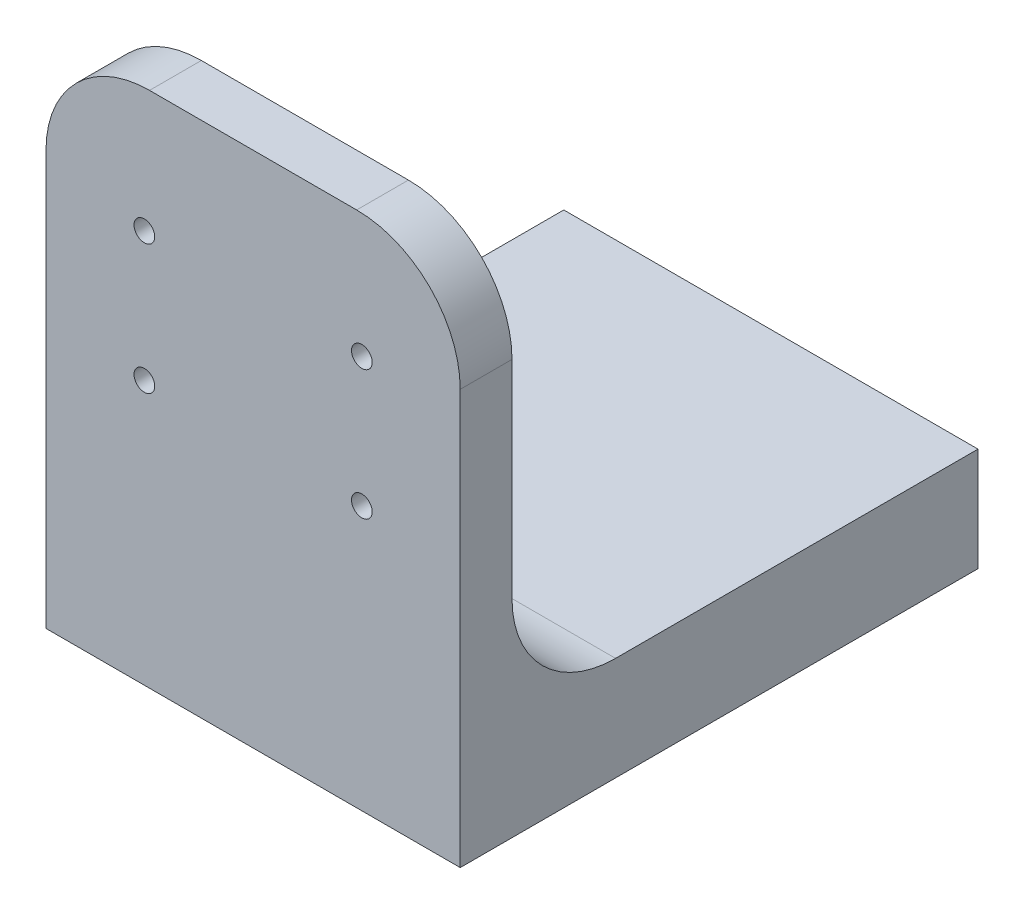
ISO-10303-21;
HEADER;
FILE_DESCRIPTION(('STEP AP214'),'2;1');
FILE_NAME('part.step','',(''),(''),'','','');
FILE_SCHEMA(('AUTOMOTIVE_DESIGN { 1 0 10303 214 1 1 1 1 }'));
ENDSEC;
DATA;
#1=APPLICATION_CONTEXT('core data for automotive mechanical design processes');
#2=APPLICATION_PROTOCOL_DEFINITION('international standard','automotive_design',2000,#1);
#3=PRODUCT_CONTEXT('',#1,'mechanical');
#4=PRODUCT('Part','Part','',(#3));
#5=PRODUCT_RELATED_PRODUCT_CATEGORY('part','',(#4));
#6=PRODUCT_DEFINITION_FORMATION('','',#4);
#7=PRODUCT_DEFINITION_CONTEXT('part definition',#1,'design');
#8=PRODUCT_DEFINITION('design','',#6,#7);
#9=PRODUCT_DEFINITION_SHAPE('','',#8);
#10=(LENGTH_UNIT() NAMED_UNIT(*) SI_UNIT(.MILLI.,.METRE.));
#11=(NAMED_UNIT(*) PLANE_ANGLE_UNIT() SI_UNIT($,.RADIAN.));
#12=(NAMED_UNIT(*) SI_UNIT($,.STERADIAN.) SOLID_ANGLE_UNIT());
#13=UNCERTAINTY_MEASURE_WITH_UNIT(LENGTH_MEASURE(1.E-05),#10,'distance_accuracy_value','');
#14=(GEOMETRIC_REPRESENTATION_CONTEXT(3) GLOBAL_UNCERTAINTY_ASSIGNED_CONTEXT((#13)) GLOBAL_UNIT_ASSIGNED_CONTEXT((#10,
#11,#12)) REPRESENTATION_CONTEXT('',''));
#15=CARTESIAN_POINT('',(0.,0.,0.));
#16=DIRECTION('',(0.,0.,1.));
#17=DIRECTION('',(1.,0.,0.));
#18=AXIS2_PLACEMENT_3D('',#15,#16,#17);
#19=CARTESIAN_POINT('',(0.,10.,0.));
#20=DIRECTION('',(0.,-1.,0.));
#21=DIRECTION('',(0.,0.,-1.));
#22=AXIS2_PLACEMENT_3D('',#19,#20,#21);
#23=PLANE('',#22);
#24=DIRECTION('',(0.,0.,1.));
#25=VECTOR('',#24,1.);
#26=CARTESIAN_POINT('',(-20.,10.,25.));
#27=LINE('',#26,#25);
#28=CARTESIAN_POINT('',(-20.,10.,-25.));
#29=VERTEX_POINT('',#28);
#30=CARTESIAN_POINT('',(-20.,10.,10.));
#31=VERTEX_POINT('',#30);
#32=EDGE_CURVE('E124',#29,#31,#27,.T.);
#33=ORIENTED_EDGE('',*,*,#32,.T.);
#34=DIRECTION('',(-1.,0.,0.));
#35=VECTOR('',#34,1.);
#36=CARTESIAN_POINT('',(20.,10.,10.));
#37=LINE('',#36,#35);
#38=CARTESIAN_POINT('',(20.,10.,10.));
#39=VERTEX_POINT('',#38);
#40=EDGE_CURVE('E54',#31,#39,#37,.F.);
#41=ORIENTED_EDGE('',*,*,#40,.T.);
#42=DIRECTION('',(0.,0.,-1.));
#43=VECTOR('',#42,1.);
#44=CARTESIAN_POINT('',(20.,10.,25.));
#45=LINE('',#44,#43);
#46=CARTESIAN_POINT('',(20.,10.,-25.));
#47=VERTEX_POINT('',#46);
#48=EDGE_CURVE('E107',#39,#47,#45,.T.);
#49=ORIENTED_EDGE('',*,*,#48,.T.);
#50=DIRECTION('',(-1.,0.,0.));
#51=VECTOR('',#50,1.);
#52=CARTESIAN_POINT('',(-20.,10.,-25.));
#53=LINE('',#52,#51);
#54=EDGE_CURVE('E109',#47,#29,#53,.T.);
#55=ORIENTED_EDGE('',*,*,#54,.T.);
#56=EDGE_LOOP('',(#33,#41,#49,#55));
#57=FACE_BOUND('',#56,.T.);
#58=ADVANCED_FACE('F38',(#57),#23,.F.);
#59=CARTESIAN_POINT('',(20.,10.,25.));
#60=DIRECTION('',(-1.,0.,0.));
#61=DIRECTION('',(0.,0.,1.));
#62=AXIS2_PLACEMENT_3D('',#59,#60,#61);
#63=PLANE('',#62);
#64=DIRECTION('',(0.,-1.,0.));
#65=VECTOR('',#64,1.);
#66=CARTESIAN_POINT('',(20.,50.,20.));
#67=LINE('',#66,#65);
#68=CARTESIAN_POINT('',(20.,40.,20.));
#69=VERTEX_POINT('',#68);
#70=CARTESIAN_POINT('',(20.,20.,20.));
#71=VERTEX_POINT('',#70);
#72=EDGE_CURVE('E188',#69,#71,#67,.T.);
#73=ORIENTED_EDGE('',*,*,#72,.F.);
#74=DIRECTION('',(0.,0.,-1.));
#75=VECTOR('',#74,1.);
#76=CARTESIAN_POINT('',(20.,40.,25.));
#77=LINE('',#76,#75);
#78=CARTESIAN_POINT('',(20.,40.,25.));
#79=VERTEX_POINT('',#78);
#80=EDGE_CURVE('E169',#69,#79,#77,.F.);
#81=ORIENTED_EDGE('',*,*,#80,.T.);
#82=DIRECTION('',(0.,-1.,0.));
#83=VECTOR('',#82,1.);
#84=CARTESIAN_POINT('',(20.,10.,25.));
#85=LINE('',#84,#83);
#86=CARTESIAN_POINT('',(20.,0.,25.));
#87=VERTEX_POINT('',#86);
#88=EDGE_CURVE('E183',#79,#87,#85,.T.);
#89=ORIENTED_EDGE('',*,*,#88,.T.);
#90=DIRECTION('',(0.,0.,-1.));
#91=VECTOR('',#90,1.);
#92=CARTESIAN_POINT('',(20.,0.,25.));
#93=LINE('',#92,#91);
#94=CARTESIAN_POINT('',(20.,0.,-25.));
#95=VERTEX_POINT('',#94);
#96=EDGE_CURVE('E128',#87,#95,#93,.T.);
#97=ORIENTED_EDGE('',*,*,#96,.T.);
#98=DIRECTION('',(0.,-1.,0.));
#99=VECTOR('',#98,1.);
#100=CARTESIAN_POINT('',(20.,10.,-25.));
#101=LINE('',#100,#99);
#102=EDGE_CURVE('E118',#47,#95,#101,.T.);
#103=ORIENTED_EDGE('',*,*,#102,.F.);
#104=ORIENTED_EDGE('',*,*,#48,.F.);
#105=CARTESIAN_POINT('',(20.,20.,10.));
#106=DIRECTION('',(-1.,0.,0.));
#107=DIRECTION('',(0.,0.,1.));
#108=AXIS2_PLACEMENT_3D('',#105,#106,#107);
#109=CIRCLE('',#108,10.);
#110=EDGE_CURVE('E11',#39,#71,#109,.T.);
#111=ORIENTED_EDGE('',*,*,#110,.T.);
#112=EDGE_LOOP('',(#73,#81,#89,#97,#103,#104,#111));
#113=FACE_BOUND('',#112,.T.);
#114=ADVANCED_FACE('F126',(#113),#63,.F.);
#115=CARTESIAN_POINT('',(-20.,10.,-25.));
#116=DIRECTION('',(0.,0.,1.));
#117=DIRECTION('',(1.,0.,0.));
#118=AXIS2_PLACEMENT_3D('',#115,#116,#117);
#119=PLANE('',#118);
#120=DIRECTION('',(-1.,0.,0.));
#121=VECTOR('',#120,1.);
#122=CARTESIAN_POINT('',(-20.,0.,-25.));
#123=LINE('',#122,#121);
#124=CARTESIAN_POINT('',(-20.,0.,-25.));
#125=VERTEX_POINT('',#124);
#126=EDGE_CURVE('E195',#95,#125,#123,.T.);
#127=ORIENTED_EDGE('',*,*,#126,.T.);
#128=DIRECTION('',(0.,-1.,0.));
#129=VECTOR('',#128,1.);
#130=CARTESIAN_POINT('',(-20.,10.,-25.));
#131=LINE('',#130,#129);
#132=EDGE_CURVE('E121',#29,#125,#131,.T.);
#133=ORIENTED_EDGE('',*,*,#132,.F.);
#134=ORIENTED_EDGE('',*,*,#54,.F.);
#135=ORIENTED_EDGE('',*,*,#102,.T.);
#136=EDGE_LOOP('',(#127,#133,#134,#135));
#137=FACE_BOUND('',#136,.T.);
#138=ADVANCED_FACE('F117',(#137),#119,.F.);
#139=CARTESIAN_POINT('',(-20.,10.,25.));
#140=DIRECTION('',(1.,0.,0.));
#141=DIRECTION('',(0.,0.,-1.));
#142=AXIS2_PLACEMENT_3D('',#139,#140,#141);
#143=PLANE('',#142);
#144=DIRECTION('',(0.,-1.,0.));
#145=VECTOR('',#144,1.);
#146=CARTESIAN_POINT('',(-20.,10.,25.));
#147=LINE('',#146,#145);
#148=CARTESIAN_POINT('',(-20.,40.,25.));
#149=VERTEX_POINT('',#148);
#150=CARTESIAN_POINT('',(-20.,0.,25.));
#151=VERTEX_POINT('',#150);
#152=EDGE_CURVE('E137',#149,#151,#147,.T.);
#153=ORIENTED_EDGE('',*,*,#152,.F.);
#154=DIRECTION('',(0.,0.,1.));
#155=VECTOR('',#154,1.);
#156=CARTESIAN_POINT('',(-20.,40.,25.));
#157=LINE('',#156,#155);
#158=CARTESIAN_POINT('',(-20.,40.,20.));
#159=VERTEX_POINT('',#158);
#160=EDGE_CURVE('E156',#149,#159,#157,.F.);
#161=ORIENTED_EDGE('',*,*,#160,.T.);
#162=DIRECTION('',(0.,-1.,0.));
#163=VECTOR('',#162,1.);
#164=CARTESIAN_POINT('',(-20.,50.,20.));
#165=LINE('',#164,#163);
#166=CARTESIAN_POINT('',(-20.,20.,20.));
#167=VERTEX_POINT('',#166);
#168=EDGE_CURVE('E179',#159,#167,#165,.T.);
#169=ORIENTED_EDGE('',*,*,#168,.T.);
#170=CARTESIAN_POINT('',(-20.,20.,10.));
#171=DIRECTION('',(1.,0.,0.));
#172=DIRECTION('',(0.,0.,-1.));
#173=AXIS2_PLACEMENT_3D('',#170,#171,#172);
#174=CIRCLE('',#173,10.);
#175=EDGE_CURVE('E47',#167,#31,#174,.T.);
#176=ORIENTED_EDGE('',*,*,#175,.T.);
#177=ORIENTED_EDGE('',*,*,#32,.F.);
#178=ORIENTED_EDGE('',*,*,#132,.T.);
#179=DIRECTION('',(0.,0.,1.));
#180=VECTOR('',#179,1.);
#181=CARTESIAN_POINT('',(-20.,0.,25.));
#182=LINE('',#181,#180);
#183=EDGE_CURVE('E203',#125,#151,#182,.T.);
#184=ORIENTED_EDGE('',*,*,#183,.T.);
#185=EDGE_LOOP('',(#153,#161,#169,#176,#177,#178,#184));
#186=FACE_BOUND('',#185,.T.);
#187=ADVANCED_FACE('F177',(#186),#143,.F.);
#188=CARTESIAN_POINT('',(-20.,10.,25.));
#189=DIRECTION('',(0.,0.,-1.));
#190=DIRECTION('',(-1.,0.,0.));
#191=AXIS2_PLACEMENT_3D('',#188,#189,#190);
#192=PLANE('',#191);
#193=CARTESIAN_POINT('',(-10.5,38.,25.));
#194=DIRECTION('',(0.,0.,1.));
#195=DIRECTION('',(1.,0.,0.));
#196=AXIS2_PLACEMENT_3D('',#193,#194,#195);
#197=CIRCLE('',#196,0.999999999999999);
#198=CARTESIAN_POINT('',(-9.5,38.,25.));
#199=VERTEX_POINT('',#198);
#200=EDGE_CURVE('E269',#199,#199,#197,.T.);
#201=ORIENTED_EDGE('',*,*,#200,.F.);
#202=EDGE_LOOP('',(#201));
#203=FACE_BOUND('',#202,.T.);
#204=CARTESIAN_POINT('',(10.5,38.,25.));
#205=DIRECTION('',(0.,0.,1.));
#206=DIRECTION('',(1.,0.,0.));
#207=AXIS2_PLACEMENT_3D('',#204,#205,#206);
#208=CIRCLE('',#207,0.999999999999999);
#209=CARTESIAN_POINT('',(11.5,38.,25.));
#210=VERTEX_POINT('',#209);
#211=EDGE_CURVE('E274',#210,#210,#208,.T.);
#212=ORIENTED_EDGE('',*,*,#211,.F.);
#213=EDGE_LOOP('',(#212));
#214=FACE_BOUND('',#213,.T.);
#215=CARTESIAN_POINT('',(-10.5,25.5,25.));
#216=DIRECTION('',(0.,0.,1.));
#217=DIRECTION('',(1.,0.,0.));
#218=AXIS2_PLACEMENT_3D('',#215,#216,#217);
#219=CIRCLE('',#218,0.999999999999999);
#220=CARTESIAN_POINT('',(-9.5,25.5,25.));
#221=VERTEX_POINT('',#220);
#222=EDGE_CURVE('E286',#221,#221,#219,.T.);
#223=ORIENTED_EDGE('',*,*,#222,.F.);
#224=EDGE_LOOP('',(#223));
#225=FACE_BOUND('',#224,.T.);
#226=CARTESIAN_POINT('',(10.5,25.5,25.));
#227=DIRECTION('',(0.,0.,1.));
#228=DIRECTION('',(1.,0.,0.));
#229=AXIS2_PLACEMENT_3D('',#226,#227,#228);
#230=CIRCLE('',#229,0.999999999999999);
#231=CARTESIAN_POINT('',(11.5,25.5,25.));
#232=VERTEX_POINT('',#231);
#233=EDGE_CURVE('E145',#232,#232,#230,.T.);
#234=ORIENTED_EDGE('',*,*,#233,.F.);
#235=EDGE_LOOP('',(#234));
#236=FACE_BOUND('',#235,.T.);
#237=DIRECTION('',(1.,0.,0.));
#238=VECTOR('',#237,1.);
#239=CARTESIAN_POINT('',(-20.,50.,25.));
#240=LINE('',#239,#238);
#241=CARTESIAN_POINT('',(-10.,50.,25.));
#242=VERTEX_POINT('',#241);
#243=CARTESIAN_POINT('',(10.,50.,25.));
#244=VERTEX_POINT('',#243);
#245=EDGE_CURVE('E144',#242,#244,#240,.T.);
#246=ORIENTED_EDGE('',*,*,#245,.F.);
#247=CARTESIAN_POINT('',(-10.,40.,25.));
#248=DIRECTION('',(0.,0.,-1.));
#249=DIRECTION('',(-1.,0.,0.));
#250=AXIS2_PLACEMENT_3D('',#247,#248,#249);
#251=CIRCLE('',#250,10.);
#252=EDGE_CURVE('E153',#242,#149,#251,.F.);
#253=ORIENTED_EDGE('',*,*,#252,.T.);
#254=ORIENTED_EDGE('',*,*,#152,.T.);
#255=DIRECTION('',(1.,0.,0.));
#256=VECTOR('',#255,1.);
#257=CARTESIAN_POINT('',(-20.,0.,25.));
#258=LINE('',#257,#256);
#259=EDGE_CURVE('E113',#151,#87,#258,.T.);
#260=ORIENTED_EDGE('',*,*,#259,.T.);
#261=ORIENTED_EDGE('',*,*,#88,.F.);
#262=CARTESIAN_POINT('',(10.,40.,25.));
#263=DIRECTION('',(0.,0.,-1.));
#264=DIRECTION('',(-1.,0.,0.));
#265=AXIS2_PLACEMENT_3D('',#262,#263,#264);
#266=CIRCLE('',#265,10.);
#267=EDGE_CURVE('E150',#79,#244,#266,.F.);
#268=ORIENTED_EDGE('',*,*,#267,.T.);
#269=EDGE_LOOP('',(#246,#253,#254,#260,#261,#268));
#270=FACE_BOUND('',#269,.T.);
#271=ADVANCED_FACE('F214',(#203,#214,#225,#236,#270),#192,.F.);
#272=CARTESIAN_POINT('',(0.,0.,0.));
#273=DIRECTION('',(0.,-1.,0.));
#274=DIRECTION('',(0.,0.,-1.));
#275=AXIS2_PLACEMENT_3D('',#272,#273,#274);
#276=PLANE('',#275);
#277=ORIENTED_EDGE('',*,*,#96,.F.);
#278=ORIENTED_EDGE('',*,*,#259,.F.);
#279=ORIENTED_EDGE('',*,*,#183,.F.);
#280=ORIENTED_EDGE('',*,*,#126,.F.);
#281=EDGE_LOOP('',(#277,#278,#279,#280));
#282=FACE_BOUND('',#281,.T.);
#283=ADVANCED_FACE('F220',(#282),#276,.T.);
#284=CARTESIAN_POINT('',(-20.,50.,20.));
#285=DIRECTION('',(0.,0.,1.));
#286=DIRECTION('',(1.,0.,0.));
#287=AXIS2_PLACEMENT_3D('',#284,#285,#286);
#288=PLANE('',#287);
#289=CARTESIAN_POINT('',(-10.5,38.,20.));
#290=DIRECTION('',(0.,0.,1.));
#291=DIRECTION('',(1.,0.,0.));
#292=AXIS2_PLACEMENT_3D('',#289,#290,#291);
#293=CIRCLE('',#292,0.999999999999996);
#294=CARTESIAN_POINT('',(-9.50000000000001,38.,20.));
#295=VERTEX_POINT('',#294);
#296=EDGE_CURVE('E272',#295,#295,#293,.T.);
#297=ORIENTED_EDGE('',*,*,#296,.T.);
#298=EDGE_LOOP('',(#297));
#299=FACE_BOUND('',#298,.T.);
#300=CARTESIAN_POINT('',(10.5,38.,20.));
#301=DIRECTION('',(0.,0.,1.));
#302=DIRECTION('',(1.,0.,0.));
#303=AXIS2_PLACEMENT_3D('',#300,#301,#302);
#304=CIRCLE('',#303,0.999999999999996);
#305=CARTESIAN_POINT('',(11.5,38.,20.));
#306=VERTEX_POINT('',#305);
#307=EDGE_CURVE('E279',#306,#306,#304,.T.);
#308=ORIENTED_EDGE('',*,*,#307,.T.);
#309=EDGE_LOOP('',(#308));
#310=FACE_BOUND('',#309,.T.);
#311=CARTESIAN_POINT('',(-10.5,25.5,20.));
#312=DIRECTION('',(0.,0.,1.));
#313=DIRECTION('',(1.,0.,0.));
#314=AXIS2_PLACEMENT_3D('',#311,#312,#313);
#315=CIRCLE('',#314,0.999999999999996);
#316=CARTESIAN_POINT('',(-9.50000000000001,25.5,20.));
#317=VERTEX_POINT('',#316);
#318=EDGE_CURVE('E290',#317,#317,#315,.T.);
#319=ORIENTED_EDGE('',*,*,#318,.T.);
#320=EDGE_LOOP('',(#319));
#321=FACE_BOUND('',#320,.T.);
#322=CARTESIAN_POINT('',(10.5,25.5,20.));
#323=DIRECTION('',(0.,0.,1.));
#324=DIRECTION('',(1.,0.,0.));
#325=AXIS2_PLACEMENT_3D('',#322,#323,#324);
#326=CIRCLE('',#325,0.999999999999996);
#327=CARTESIAN_POINT('',(11.5,25.5,20.));
#328=VERTEX_POINT('',#327);
#329=EDGE_CURVE('E141',#328,#328,#326,.T.);
#330=ORIENTED_EDGE('',*,*,#329,.T.);
#331=EDGE_LOOP('',(#330));
#332=FACE_BOUND('',#331,.T.);
#333=ORIENTED_EDGE('',*,*,#168,.F.);
#334=CARTESIAN_POINT('',(-10.,40.,20.));
#335=DIRECTION('',(0.,0.,1.));
#336=DIRECTION('',(1.,0.,0.));
#337=AXIS2_PLACEMENT_3D('',#334,#335,#336);
#338=CIRCLE('',#337,10.);
#339=CARTESIAN_POINT('',(-10.,50.,20.));
#340=VERTEX_POINT('',#339);
#341=EDGE_CURVE('E166',#159,#340,#338,.F.);
#342=ORIENTED_EDGE('',*,*,#341,.T.);
#343=DIRECTION('',(-1.,0.,0.));
#344=VECTOR('',#343,1.);
#345=CARTESIAN_POINT('',(-20.,50.,20.));
#346=LINE('',#345,#344);
#347=CARTESIAN_POINT('',(10.,50.,20.));
#348=VERTEX_POINT('',#347);
#349=EDGE_CURVE('E197',#348,#340,#346,.T.);
#350=ORIENTED_EDGE('',*,*,#349,.F.);
#351=CARTESIAN_POINT('',(10.,40.,20.));
#352=DIRECTION('',(0.,0.,1.));
#353=DIRECTION('',(1.,0.,0.));
#354=AXIS2_PLACEMENT_3D('',#351,#352,#353);
#355=CIRCLE('',#354,10.);
#356=EDGE_CURVE('E163',#348,#69,#355,.F.);
#357=ORIENTED_EDGE('',*,*,#356,.T.);
#358=ORIENTED_EDGE('',*,*,#72,.T.);
#359=DIRECTION('',(-1.,0.,0.));
#360=VECTOR('',#359,1.);
#361=CARTESIAN_POINT('',(-20.,20.,20.));
#362=LINE('',#361,#360);
#363=EDGE_CURVE('E159',#71,#167,#362,.T.);
#364=ORIENTED_EDGE('',*,*,#363,.T.);
#365=EDGE_LOOP('',(#333,#342,#350,#357,#358,#364));
#366=FACE_BOUND('',#365,.T.);
#367=ADVANCED_FACE('F186',(#299,#310,#321,#332,#366),#288,.F.);
#368=CARTESIAN_POINT('',(0.,50.,0.));
#369=DIRECTION('',(0.,-1.,0.));
#370=DIRECTION('',(0.,0.,-1.));
#371=AXIS2_PLACEMENT_3D('',#368,#369,#370);
#372=PLANE('',#371);
#373=ORIENTED_EDGE('',*,*,#349,.T.);
#374=DIRECTION('',(0.,0.,1.));
#375=VECTOR('',#374,1.);
#376=CARTESIAN_POINT('',(-10.,50.,0.));
#377=LINE('',#376,#375);
#378=EDGE_CURVE('E135',#340,#242,#377,.T.);
#379=ORIENTED_EDGE('',*,*,#378,.T.);
#380=ORIENTED_EDGE('',*,*,#245,.T.);
#381=DIRECTION('',(0.,0.,-1.));
#382=VECTOR('',#381,1.);
#383=CARTESIAN_POINT('',(10.,50.,0.));
#384=LINE('',#383,#382);
#385=EDGE_CURVE('E130',#244,#348,#384,.T.);
#386=ORIENTED_EDGE('',*,*,#385,.T.);
#387=EDGE_LOOP('',(#373,#379,#380,#386));
#388=FACE_BOUND('',#387,.T.);
#389=ADVANCED_FACE('F228',(#388),#372,.F.);
#390=CARTESIAN_POINT('',(10.5,25.5,25.));
#391=DIRECTION('',(0.,0.,1.));
#392=DIRECTION('',(1.,0.,0.));
#393=AXIS2_PLACEMENT_3D('',#390,#391,#392);
#394=CYLINDRICAL_SURFACE('',#393,0.999999999999996);
#395=ORIENTED_EDGE('',*,*,#233,.T.);
#396=EDGE_LOOP('',(#395));
#397=FACE_BOUND('',#396,.T.);
#398=ORIENTED_EDGE('',*,*,#329,.F.);
#399=EDGE_LOOP('',(#398));
#400=FACE_BOUND('',#399,.T.);
#401=ADVANCED_FACE('F244',(#397,#400),#394,.F.);
#402=CARTESIAN_POINT('',(-10.5,25.5,25.));
#403=DIRECTION('',(0.,0.,1.));
#404=DIRECTION('',(1.,0.,0.));
#405=AXIS2_PLACEMENT_3D('',#402,#403,#404);
#406=CYLINDRICAL_SURFACE('',#405,0.999999999999996);
#407=ORIENTED_EDGE('',*,*,#222,.T.);
#408=EDGE_LOOP('',(#407));
#409=FACE_BOUND('',#408,.T.);
#410=ORIENTED_EDGE('',*,*,#318,.F.);
#411=EDGE_LOOP('',(#410));
#412=FACE_BOUND('',#411,.T.);
#413=ADVANCED_FACE('F248',(#409,#412),#406,.F.);
#414=CARTESIAN_POINT('',(10.5,38.,25.));
#415=DIRECTION('',(0.,0.,1.));
#416=DIRECTION('',(1.,0.,0.));
#417=AXIS2_PLACEMENT_3D('',#414,#415,#416);
#418=CYLINDRICAL_SURFACE('',#417,0.999999999999996);
#419=ORIENTED_EDGE('',*,*,#211,.T.);
#420=EDGE_LOOP('',(#419));
#421=FACE_BOUND('',#420,.T.);
#422=ORIENTED_EDGE('',*,*,#307,.F.);
#423=EDGE_LOOP('',(#422));
#424=FACE_BOUND('',#423,.T.);
#425=ADVANCED_FACE('F252',(#421,#424),#418,.F.);
#426=CARTESIAN_POINT('',(-10.5,38.,25.));
#427=DIRECTION('',(0.,0.,1.));
#428=DIRECTION('',(1.,0.,0.));
#429=AXIS2_PLACEMENT_3D('',#426,#427,#428);
#430=CYLINDRICAL_SURFACE('',#429,0.999999999999996);
#431=ORIENTED_EDGE('',*,*,#200,.T.);
#432=EDGE_LOOP('',(#431));
#433=FACE_BOUND('',#432,.T.);
#434=ORIENTED_EDGE('',*,*,#296,.F.);
#435=EDGE_LOOP('',(#434));
#436=FACE_BOUND('',#435,.T.);
#437=ADVANCED_FACE('F256',(#433,#436),#430,.F.);
#438=CARTESIAN_POINT('',(-10.,40.,0.));
#439=DIRECTION('',(0.,0.,1.));
#440=DIRECTION('',(1.,0.,0.));
#441=AXIS2_PLACEMENT_3D('',#438,#439,#440);
#442=CYLINDRICAL_SURFACE('',#441,10.);
#443=ORIENTED_EDGE('',*,*,#341,.F.);
#444=ORIENTED_EDGE('',*,*,#160,.F.);
#445=ORIENTED_EDGE('',*,*,#252,.F.);
#446=ORIENTED_EDGE('',*,*,#378,.F.);
#447=EDGE_LOOP('',(#443,#444,#445,#446));
#448=FACE_BOUND('',#447,.T.);
#449=ADVANCED_FACE('F259',(#448),#442,.T.);
#450=CARTESIAN_POINT('',(10.,40.,0.));
#451=DIRECTION('',(0.,0.,-1.));
#452=DIRECTION('',(-1.,0.,0.));
#453=AXIS2_PLACEMENT_3D('',#450,#451,#452);
#454=CYLINDRICAL_SURFACE('',#453,10.);
#455=ORIENTED_EDGE('',*,*,#267,.F.);
#456=ORIENTED_EDGE('',*,*,#80,.F.);
#457=ORIENTED_EDGE('',*,*,#356,.F.);
#458=ORIENTED_EDGE('',*,*,#385,.F.);
#459=EDGE_LOOP('',(#455,#456,#457,#458));
#460=FACE_BOUND('',#459,.T.);
#461=ADVANCED_FACE('F263',(#460),#454,.T.);
#462=CARTESIAN_POINT('',(-20.,20.,10.));
#463=DIRECTION('',(1.,0.,0.));
#464=DIRECTION('',(0.,0.,-1.));
#465=AXIS2_PLACEMENT_3D('',#462,#463,#464);
#466=CYLINDRICAL_SURFACE('',#465,10.);
#467=ORIENTED_EDGE('',*,*,#110,.F.);
#468=ORIENTED_EDGE('',*,*,#40,.F.);
#469=ORIENTED_EDGE('',*,*,#175,.F.);
#470=ORIENTED_EDGE('',*,*,#363,.F.);
#471=EDGE_LOOP('',(#467,#468,#469,#470));
#472=FACE_BOUND('',#471,.T.);
#473=ADVANCED_FACE('F40',(#472),#466,.F.);
#474=CLOSED_SHELL('',(#58,#114,#138,#187,#271,#283,#367,#389,#401,#413,#425,#437,#449,#461,#473));
#475=MANIFOLD_SOLID_BREP('B2',#474);
#476=ADVANCED_BREP_SHAPE_REPRESENTATION('',(#18,#475),#14);
#477=SHAPE_DEFINITION_REPRESENTATION(#9,#476);
ENDSEC;
END-ISO-10303-21;
